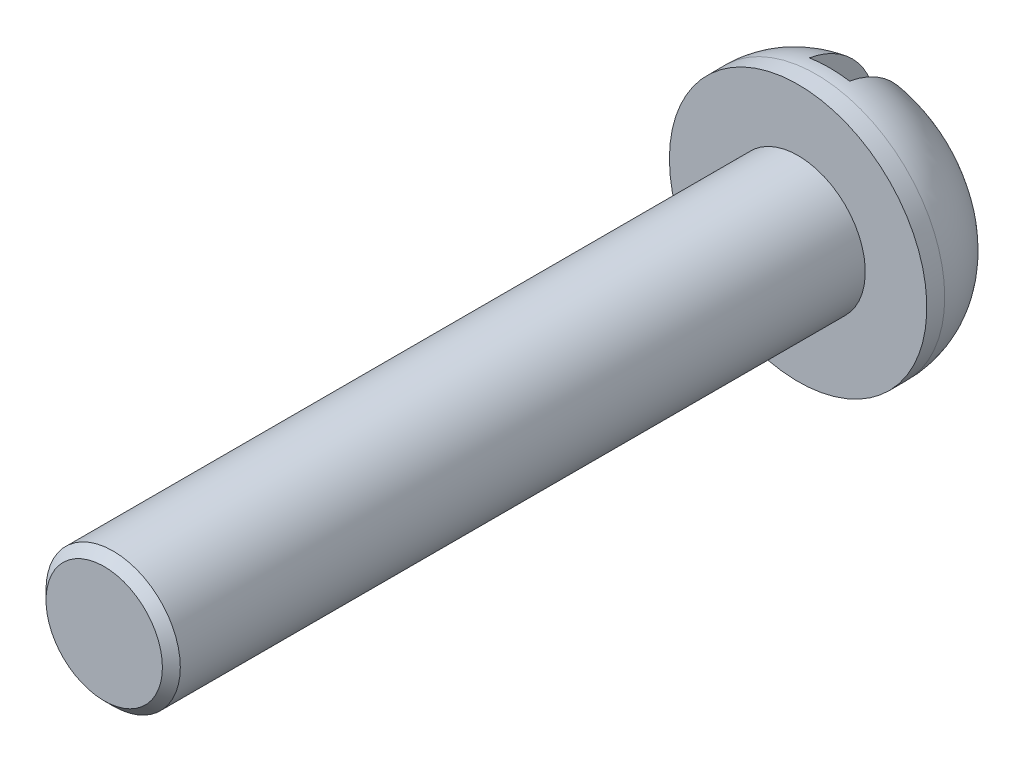
ISO-10303-21;
HEADER;
FILE_DESCRIPTION(('STEP AP214'),'2;1');
FILE_NAME('part.step','',(''),(''),'','','');
FILE_SCHEMA(('AUTOMOTIVE_DESIGN { 1 0 10303 214 1 1 1 1 }'));
ENDSEC;
DATA;
#1=APPLICATION_CONTEXT('core data for automotive mechanical design processes');
#2=APPLICATION_PROTOCOL_DEFINITION('international standard','automotive_design',2000,#1);
#3=PRODUCT_CONTEXT('',#1,'mechanical');
#4=PRODUCT('Part','Part','',(#3));
#5=PRODUCT_RELATED_PRODUCT_CATEGORY('part','',(#4));
#6=PRODUCT_DEFINITION_FORMATION('','',#4);
#7=PRODUCT_DEFINITION_CONTEXT('part definition',#1,'design');
#8=PRODUCT_DEFINITION('design','',#6,#7);
#9=PRODUCT_DEFINITION_SHAPE('','',#8);
#10=(LENGTH_UNIT() NAMED_UNIT(*) SI_UNIT(.MILLI.,.METRE.));
#11=(NAMED_UNIT(*) PLANE_ANGLE_UNIT() SI_UNIT($,.RADIAN.));
#12=(NAMED_UNIT(*) SI_UNIT($,.STERADIAN.) SOLID_ANGLE_UNIT());
#13=UNCERTAINTY_MEASURE_WITH_UNIT(LENGTH_MEASURE(1.E-05),#10,'distance_accuracy_value','');
#14=(GEOMETRIC_REPRESENTATION_CONTEXT(3) GLOBAL_UNCERTAINTY_ASSIGNED_CONTEXT((#13)) GLOBAL_UNIT_ASSIGNED_CONTEXT((#10,
#11,#12)) REPRESENTATION_CONTEXT('',''));
#15=CARTESIAN_POINT('',(0.,0.,0.));
#16=DIRECTION('',(0.,0.,1.));
#17=DIRECTION('',(1.,0.,0.));
#18=AXIS2_PLACEMENT_3D('',#15,#16,#17);
#19=CARTESIAN_POINT('',(0.,0.,0.));
#20=DIRECTION('',(0.,0.,1.));
#21=DIRECTION('',(1.,0.,0.));
#22=AXIS2_PLACEMENT_3D('',#19,#20,#21);
#23=PLANE('',#22);
#24=CARTESIAN_POINT('',(0.,0.,0.));
#25=DIRECTION('',(0.,0.,1.));
#26=DIRECTION('',(1.,0.,0.));
#27=AXIS2_PLACEMENT_3D('',#24,#25,#26);
#28=CIRCLE('',#27,1.075);
#29=CARTESIAN_POINT('',(0.45,0.976281209488332,0.));
#30=VERTEX_POINT('',#29);
#31=CARTESIAN_POINT('',(0.45,-0.976281209488332,0.));
#32=VERTEX_POINT('',#31);
#33=EDGE_CURVE('E100',#30,#32,#28,.F.);
#34=ORIENTED_EDGE('',*,*,#33,.T.);
#35=DIRECTION('',(0.,-1.,0.));
#36=VECTOR('',#35,1.);
#37=CARTESIAN_POINT('',(0.45,3.06077102765736,0.));
#38=LINE('',#37,#36);
#39=EDGE_CURVE('E89',#30,#32,#38,.T.);
#40=ORIENTED_EDGE('',*,*,#39,.F.);
#41=EDGE_LOOP('',(#34,#40));
#42=FACE_BOUND('',#41,.T.);
#43=ADVANCED_FACE('F45',(#42),#23,.F.);
#44=CARTESIAN_POINT('',(0.,0.,17.7));
#45=DIRECTION('',(0.,0.,-1.));
#46=DIRECTION('',(-1.,0.,0.));
#47=AXIS2_PLACEMENT_3D('',#44,#45,#46);
#48=CYLINDRICAL_SURFACE('',#47,1.5);
#49=CARTESIAN_POINT('',(0.,0.,17.5));
#50=DIRECTION('',(0.,0.,1.));
#51=DIRECTION('',(1.,0.,0.));
#52=AXIS2_PLACEMENT_3D('',#49,#50,#51);
#53=CIRCLE('',#52,1.5);
#54=CARTESIAN_POINT('',(1.5,0.,17.5));
#55=VERTEX_POINT('',#54);
#56=EDGE_CURVE('E11',#55,#55,#53,.F.);
#57=ORIENTED_EDGE('',*,*,#56,.T.);
#58=EDGE_LOOP('',(#57));
#59=FACE_BOUND('',#58,.T.);
#60=CARTESIAN_POINT('',(0.,0.,2.2));
#61=DIRECTION('',(0.,0.,-1.));
#62=DIRECTION('',(-1.,0.,0.));
#63=AXIS2_PLACEMENT_3D('',#60,#61,#62);
#64=CIRCLE('',#63,1.5);
#65=CARTESIAN_POINT('',(-1.5,0.,2.2));
#66=VERTEX_POINT('',#65);
#67=EDGE_CURVE('E106',#66,#66,#64,.T.);
#68=ORIENTED_EDGE('',*,*,#67,.F.);
#69=EDGE_LOOP('',(#68));
#70=FACE_BOUND('',#69,.T.);
#71=ADVANCED_FACE('F151',(#59,#70),#48,.T.);
#72=CARTESIAN_POINT('',(0.,0.,17.7));
#73=DIRECTION('',(0.,0.,1.));
#74=DIRECTION('',(1.,0.,0.));
#75=AXIS2_PLACEMENT_3D('',#72,#73,#74);
#76=PLANE('',#75);
#77=CARTESIAN_POINT('',(0.,0.,17.7));
#78=DIRECTION('',(0.,0.,1.));
#79=DIRECTION('',(1.,0.,0.));
#80=AXIS2_PLACEMENT_3D('',#77,#78,#79);
#81=CIRCLE('',#80,1.3);
#82=CARTESIAN_POINT('',(1.3,0.,17.7));
#83=VERTEX_POINT('',#82);
#84=EDGE_CURVE('E54',#83,#83,#81,.T.);
#85=ORIENTED_EDGE('',*,*,#84,.T.);
#86=EDGE_LOOP('',(#85));
#87=FACE_BOUND('',#86,.T.);
#88=ADVANCED_FACE('F147',(#87),#76,.T.);
#89=CARTESIAN_POINT('',(0.,0.,2.2));
#90=DIRECTION('',(0.,0.,-1.));
#91=DIRECTION('',(-1.,0.,0.));
#92=AXIS2_PLACEMENT_3D('',#89,#90,#91);
#93=CYLINDRICAL_SURFACE('',#92,2.875);
#94=CARTESIAN_POINT('',(0.,0.,1.8));
#95=DIRECTION('',(0.,0.,1.));
#96=DIRECTION('',(1.,0.,0.));
#97=AXIS2_PLACEMENT_3D('',#94,#95,#96);
#98=CIRCLE('',#97,2.875);
#99=CARTESIAN_POINT('',(2.875,0.,1.8));
#100=VERTEX_POINT('',#99);
#101=EDGE_CURVE('E109',#100,#100,#98,.T.);
#102=ORIENTED_EDGE('',*,*,#101,.T.);
#103=EDGE_LOOP('',(#102));
#104=FACE_BOUND('',#103,.T.);
#105=CARTESIAN_POINT('',(0.,0.,2.2));
#106=DIRECTION('',(0.,0.,-1.));
#107=DIRECTION('',(-1.,0.,0.));
#108=AXIS2_PLACEMENT_3D('',#105,#106,#107);
#109=CIRCLE('',#108,2.875);
#110=CARTESIAN_POINT('',(-2.875,0.,2.2));
#111=VERTEX_POINT('',#110);
#112=EDGE_CURVE('E111',#111,#111,#109,.T.);
#113=ORIENTED_EDGE('',*,*,#112,.T.);
#114=EDGE_LOOP('',(#113));
#115=FACE_BOUND('',#114,.T.);
#116=ADVANCED_FACE('F143',(#104,#115),#93,.T.);
#117=CARTESIAN_POINT('',(0.,0.,2.2));
#118=DIRECTION('',(0.,0.,-1.));
#119=DIRECTION('',(-1.,0.,0.));
#120=AXIS2_PLACEMENT_3D('',#117,#118,#119);
#121=PLANE('',#120);
#122=ORIENTED_EDGE('',*,*,#67,.T.);
#123=EDGE_LOOP('',(#122));
#124=FACE_BOUND('',#123,.T.);
#125=ORIENTED_EDGE('',*,*,#112,.F.);
#126=EDGE_LOOP('',(#125));
#127=FACE_BOUND('',#126,.T.);
#128=ADVANCED_FACE('F139',(#124,#127),#121,.F.);
#129=CARTESIAN_POINT('',(-0.45,-0.976281209488332,0.));
#130=VERTEX_POINT('',#129);
#131=CARTESIAN_POINT('',(-0.45,0.976281209488332,0.));
#132=VERTEX_POINT('',#131);
#133=EDGE_CURVE('E105',#130,#132,#28,.F.);
#134=ORIENTED_EDGE('',*,*,#133,.T.);
#135=DIRECTION('',(0.,1.,0.));
#136=VECTOR('',#135,1.);
#137=CARTESIAN_POINT('',(-0.45,3.06077102765736,0.));
#138=LINE('',#137,#136);
#139=EDGE_CURVE('E101',#130,#132,#138,.T.);
#140=ORIENTED_EDGE('',*,*,#139,.F.);
#141=EDGE_LOOP('',(#134,#140));
#142=FACE_BOUND('',#141,.T.);
#143=ADVANCED_FACE('F142',(#142),#23,.F.);
#144=CARTESIAN_POINT('',(0.,0.,1.8));
#145=DIRECTION('',(0.,0.,1.));
#146=DIRECTION('',(1.,0.,0.));
#147=AXIS2_PLACEMENT_3D('',#144,#145,#146);
#148=DEGENERATE_TOROIDAL_SURFACE('',#147,1.075,1.8,.T.);
#149=CARTESIAN_POINT('',(0.45,0.,0.111990817560521));
#150=CARTESIAN_POINT('',(0.45,-0.0387826155548397,0.111992743989185));
#151=CARTESIAN_POINT('',(0.45,-0.0775648359462005,0.110071620904703));
#152=CARTESIAN_POINT('',(0.45,-0.15487899058544,0.103121875251416));
#153=CARTESIAN_POINT('',(0.45,-0.193410416254374,0.0980882125636361));
#154=CARTESIAN_POINT('',(0.45,-0.27072407865126,0.0863019588837042));
#155=CARTESIAN_POINT('',(0.45,-0.309502593852977,0.0795269100193666));
#156=CARTESIAN_POINT('',(0.45,-0.386985207156666,0.065635672625954));
#157=CARTESIAN_POINT('',(0.45,-0.425689321131183,0.0585195678841712));
#158=CARTESIAN_POINT('',(0.45,-0.503574337512526,0.0448155729173377));
#159=CARTESIAN_POINT('',(0.45,-0.542756284259483,0.0382333226136575));
#160=CARTESIAN_POINT('',(0.45,-0.62130090475367,0.0263024655528295));
#161=CARTESIAN_POINT('',(0.45,-0.660663544126603,0.0209536333281874));
#162=CARTESIAN_POINT('',(0.45,-0.779038245266762,0.00741689809901502));
#163=CARTESIAN_POINT('',(0.45,-0.858371486625916,0.00173183700961173));
#164=CARTESIAN_POINT('',(0.45,-1.01643830589918,-0.00104421905486276));
#165=CARTESIAN_POINT('',(0.45,-1.09517005898092,0.00178038389110171));
#166=CARTESIAN_POINT('',(0.45,-1.25178689588554,0.0166289274744156));
#167=CARTESIAN_POINT('',(0.45,-1.32967211611734,0.0286513630123992));
#168=CARTESIAN_POINT('',(0.45,-1.45718753062557,0.0564552265827371));
#169=CARTESIAN_POINT('',(0.45,-1.50741186928829,0.0695644438093229));
#170=CARTESIAN_POINT('',(0.45,-1.60658649473929,0.0998756842538949));
#171=CARTESIAN_POINT('',(0.45,-1.65553715931277,0.117076478154114));
#172=CARTESIAN_POINT('',(0.45,-1.80030428590954,0.17489621331869));
#173=CARTESIAN_POINT('',(0.45,-1.8937530351095,0.221671433759531));
#174=CARTESIAN_POINT('',(0.45,-2.07127478753966,0.330481295221218));
#175=CARTESIAN_POINT('',(0.45,-2.15534594854283,0.392518926896082));
#176=CARTESIAN_POINT('',(0.45,-2.31145665473674,0.530089929343106));
#177=CARTESIAN_POINT('',(0.45,-2.38351085064421,0.605606630713727));
#178=CARTESIAN_POINT('',(0.45,-2.51187916211104,0.766024848295385));
#179=CARTESIAN_POINT('',(0.45,-2.56852975758962,0.850657396958423));
#180=CARTESIAN_POINT('',(0.45,-2.6666582757214,1.02834131300746));
#181=CARTESIAN_POINT('',(0.45,-2.70813215989147,1.12139491300888));
#182=CARTESIAN_POINT('',(0.45,-2.77427706019269,1.31216154450052));
#183=CARTESIAN_POINT('',(0.45,-2.79912504581638,1.4098132594205));
#184=CARTESIAN_POINT('',(0.45,-2.83200291825927,1.60789726524021));
#185=CARTESIAN_POINT('',(0.45,-2.84003501465312,1.70832918906859));
#186=CARTESIAN_POINT('',(0.45,-2.83905253230767,1.90873066877063));
#187=CARTESIAN_POINT('',(0.45,-2.83010183721162,2.00870054497298));
#188=CARTESIAN_POINT('',(0.45,-2.79554074152477,2.2057239745265));
#189=CARTESIAN_POINT('',(0.45,-2.76992929056721,2.30277734360471));
#190=CARTESIAN_POINT('',(0.45,-2.70279344778238,2.49120979176871));
#191=CARTESIAN_POINT('',(0.45,-2.66126952345899,2.58258903746696));
#192=CARTESIAN_POINT('',(0.45,-2.56352871236733,2.75709300550172));
#193=CARTESIAN_POINT('',(0.45,-2.5073144409347,2.84021919350612));
#194=CARTESIAN_POINT('',(0.45,-2.38160811822572,2.99619510441082));
#195=CARTESIAN_POINT('',(0.45,-2.31207280966814,3.06900996546156));
#196=CARTESIAN_POINT('',(0.45,-2.16184234459374,3.20209736658302));
#197=CARTESIAN_POINT('',(0.45,-2.08114085785866,3.26236274333375));
#198=CARTESIAN_POINT('',(0.45,-1.91000005946726,3.3693252229814));
#199=CARTESIAN_POINT('',(0.45,-1.8194697703986,3.41587757208682));
#200=CARTESIAN_POINT('',(0.45,-1.67905452004504,3.47406978962672));
#201=CARTESIAN_POINT('',(0.45,-1.63149304020008,3.49152464217923));
#202=CARTESIAN_POINT('',(0.45,-1.53511545655797,3.5225324124537));
#203=CARTESIAN_POINT('',(0.45,-1.48629966208519,3.53608628231919));
#204=CARTESIAN_POINT('',(0.45,-1.38647509436916,3.55957104516167));
#205=CARTESIAN_POINT('',(0.45,-1.33544226007622,3.56939912766612));
#206=CARTESIAN_POINT('',(0.45,-1.2327237210493,3.58498066616109));
#207=CARTESIAN_POINT('',(0.45,-1.18103757398112,3.59073119233643));
#208=CARTESIAN_POINT('',(0.45,-1.07723216207413,3.59828490818898));
#209=CARTESIAN_POINT('',(0.45,-1.02511207550143,3.60007659108487));
#210=CARTESIAN_POINT('',(0.45,-0.920976536590033,3.59991861311204));
#211=CARTESIAN_POINT('',(0.45,-0.868961062572562,3.59797557986048));
#212=CARTESIAN_POINT('',(0.45,-0.774819366749058,3.5914411294002));
#213=CARTESIAN_POINT('',(0.45,-0.732651864720865,3.58740903116742));
#214=CARTESIAN_POINT('',(0.45,-0.648533299396359,3.57749409747983));
#215=CARTESIAN_POINT('',(0.45,-0.606582270588852,3.57161097584003));
#216=CARTESIAN_POINT('',(0.45,-0.522776435447137,3.55850488950656));
#217=CARTESIAN_POINT('',(0.45,-0.480922234232089,3.55127819261063));
#218=CARTESIAN_POINT('',(0.45,-0.397270452976825,3.53632617569089));
#219=CARTESIAN_POINT('',(0.45,-0.355472951206495,3.52860043743096));
#220=CARTESIAN_POINT('',(0.45,-0.271579907355744,3.51392564061571));
#221=CARTESIAN_POINT('',(0.45,-0.229483833975917,3.5069794466245));
#222=CARTESIAN_POINT('',(0.45,-0.14496880634488,3.49579594154042));
#223=CARTESIAN_POINT('',(0.45,-0.10255067804166,3.49155317619297));
#224=CARTESIAN_POINT('',(0.45,-0.0388281288627513,3.48844598399214));
#225=CARTESIAN_POINT('',(0.45,-0.0176044559393729,3.48795133212002));
#226=CARTESIAN_POINT('',(0.45,0.0248395699279757,3.48807780019897));
#227=CARTESIAN_POINT('',(0.45,0.0460599228607077,3.48869892384863));
#228=CARTESIAN_POINT('',(0.45,0.109686411643126,3.49215845615111));
#229=CARTESIAN_POINT('',(0.45,0.152003589919307,3.49659551071752));
#230=CARTESIAN_POINT('',(0.45,0.237977383119774,3.50826924452313));
#231=CARTESIAN_POINT('',(0.45,0.281617254991609,3.51561384646717));
#232=CARTESIAN_POINT('',(0.45,0.36875299177796,3.53101139690848));
#233=CARTESIAN_POINT('',(0.45,0.412248888212945,3.53906417802649));
#234=CARTESIAN_POINT('',(0.45,0.499540591917558,3.55451703597811));
#235=CARTESIAN_POINT('',(0.45,0.543336904685045,3.56191440079828));
#236=CARTESIAN_POINT('',(0.45,0.631165230665646,3.57512845538778));
#237=CARTESIAN_POINT('',(0.45,0.675197188689329,3.58094550006173));
#238=CARTESIAN_POINT('',(0.45,0.763307298765446,3.59042032079326));
#239=CARTESIAN_POINT('',(0.45,0.80738440291013,3.59408744700503));
#240=CARTESIAN_POINT('',(0.45,0.895672532687234,3.59895189881418));
#241=CARTESIAN_POINT('',(0.45,0.939883566950239,3.60014906170176));
#242=CARTESIAN_POINT('',(0.45,1.07255214122173,3.59965973236802));
#243=CARTESIAN_POINT('',(0.45,1.16105918970058,3.5938940996656));
#244=CARTESIAN_POINT('',(0.45,1.30023218803208,3.57536976748434));
#245=CARTESIAN_POINT('',(0.45,1.35144429168455,3.56647785915307));
#246=CARTESIAN_POINT('',(0.45,1.45294959519744,3.54458223967519));
#247=CARTESIAN_POINT('',(0.45,1.50324350952078,3.53158188344366));
#248=CARTESIAN_POINT('',(0.45,1.60314213880058,3.5012960279312));
#249=CARTESIAN_POINT('',(0.45,1.65273288494521,3.48396429591564));
#250=CARTESIAN_POINT('',(0.45,1.75027071259029,3.4451627623954));
#251=CARTESIAN_POINT('',(0.45,1.79821730615756,3.42369174478624));
#252=CARTESIAN_POINT('',(0.45,1.93888821667195,3.35328313410146));
#253=CARTESIAN_POINT('',(0.45,2.0286745805483,3.29828021502286));
#254=CARTESIAN_POINT('',(0.45,2.19694325298825,3.17389126098089));
#255=CARTESIAN_POINT('',(0.45,2.27547692910342,3.1045743578116));
#256=CARTESIAN_POINT('',(0.45,2.41765641549566,2.95514162554828));
#257=CARTESIAN_POINT('',(0.45,2.48160831379603,2.87531734123359));
#258=CARTESIAN_POINT('',(0.45,2.59507825814024,2.70581634459148));
#259=CARTESIAN_POINT('',(0.45,2.64457454393616,2.61612505585185));
#260=CARTESIAN_POINT('',(0.45,2.72691235866232,2.43093820793361));
#261=CARTESIAN_POINT('',(0.45,2.75998180441267,2.33554392231157));
#262=CARTESIAN_POINT('',(0.45,2.80953018097771,2.1405880555792));
#263=CARTESIAN_POINT('',(0.45,2.82601747427527,2.04102860140286));
#264=CARTESIAN_POINT('',(0.45,2.8419051144125,1.84104159473499));
#265=CARTESIAN_POINT('',(0.45,2.84138762367965,1.74062055962017));
#266=CARTESIAN_POINT('',(0.45,2.82348353409932,1.54128214590026));
#267=CARTESIAN_POINT('',(0.45,2.8060950622689,1.44236493548522));
#268=CARTESIAN_POINT('',(0.45,2.75497887225999,1.24894951877124));
#269=CARTESIAN_POINT('',(0.45,2.72126681337434,1.15444717234543));
#270=CARTESIAN_POINT('',(0.45,2.63849368490103,0.972426863585774));
#271=CARTESIAN_POINT('',(0.45,2.58943287803842,0.884908781734206));
#272=CARTESIAN_POINT('',(0.45,2.4772449779073,0.719085873615677));
#273=CARTESIAN_POINT('',(0.45,2.41408252833263,0.640804974829747));
#274=CARTESIAN_POINT('',(0.45,2.27560686477592,0.495870694847435));
#275=CARTESIAN_POINT('',(0.45,2.20029443585524,0.429216562975385));
#276=CARTESIAN_POINT('',(0.45,2.03908498896593,0.308833340377374));
#277=CARTESIAN_POINT('',(0.45,1.95311270694017,0.255205107568513));
#278=CARTESIAN_POINT('',(0.45,1.77349387660786,0.162813658121992));
#279=CARTESIAN_POINT('',(0.45,1.67984414427691,0.124056647177889));
#280=CARTESIAN_POINT('',(0.45,1.48550845860714,0.0614818226616815));
#281=CARTESIAN_POINT('',(0.45,1.38471549937438,0.0379977495445135));
#282=CARTESIAN_POINT('',(0.45,1.18093294073881,0.00724140029146806));
#283=CARTESIAN_POINT('',(0.45,1.07794796922707,-6.2157747013705E-05));
#284=CARTESIAN_POINT('',(0.45,0.893449953600242,4.99140293479615E-05));
#285=CARTESIAN_POINT('',(0.45,0.811908685727201,0.00472960025778218));
#286=CARTESIAN_POINT('',(0.45,0.690041197463315,0.0173056038902441));
#287=CARTESIAN_POINT('',(0.45,0.649398743618315,0.0224421575558926));
#288=CARTESIAN_POINT('',(0.45,0.568318319537822,0.0341453203830687));
#289=CARTESIAN_POINT('',(0.45,0.527880368762083,0.040712063110364));
#290=CARTESIAN_POINT('',(0.45,0.446847504127388,0.0546976276373903));
#291=CARTESIAN_POINT('',(0.45,0.406253675523876,0.0621224502215177));
#292=CARTESIAN_POINT('',(0.45,0.3250026767942,0.0767849136464867));
#293=CARTESIAN_POINT('',(0.45,0.284345482513635,0.084022427064857));
#294=CARTESIAN_POINT('',(0.45,0.20321240405912,0.0967416961237444));
#295=CARTESIAN_POINT('',(0.45,0.162739817914281,0.102242698843929));
#296=CARTESIAN_POINT('',(0.45,0.0815108983093145,0.109863118483228));
#297=CARTESIAN_POINT('',(0.45,0.0407552309624018,0.111988793147158));
#298=CARTESIAN_POINT('',(0.45,0.,0.111990817560521));
#299=B_SPLINE_CURVE_WITH_KNOTS('',3,(#149,#150,#151,#152,#153,#154,#155,#156,#157,#158,#159,
#160,#161,#162,#163,#164,#165,#166,#167,#168,#169,#170,#171,#172,#173,#174,#175,#176,#177,#178,
#179,#180,#181,#182,#183,#184,#185,#186,#187,#188,#189,#190,#191,#192,#193,#194,#195,#196,#197,
#198,#199,#200,#201,#202,#203,#204,#205,#206,#207,#208,#209,#210,#211,#212,#213,#214,#215,#216,
#217,#218,#219,#220,#221,#222,#223,#224,#225,#226,#227,#228,#229,#230,#231,#232,#233,#234,#235,
#236,#237,#238,#239,#240,#241,#242,#243,#244,#245,#246,#247,#248,#249,#250,#251,#252,#253,#254,
#255,#256,#257,#258,#259,#260,#261,#262,#263,#264,#265,#266,#267,#268,#269,#270,#271,#272,#273,
#274,#275,#276,#277,#278,#279,#280,#281,#282,#283,#284,#285,#286,#287,#288,#289,#290,#291,#292,
#293,#294,#295,#296,#297,#298),.UNSPECIFIED.,.T.,.F.,(4,2,2,2,2,2,2,2,2,2,2,2,2,2,2,2,2,2,2,2,2,
2,2,2,2,2,2,2,2,2,2,2,2,2,2,2,2,2,2,2,2,2,2,2,2,2,2,2,2,2,2,2,2,2,2,2,2,2,2,2,2,2,2,2,2,2,2,2,2,
2,2,2,2,2,4),(0.,0.116315567840449,0.232819979899999,0.350909696927653,0.468970550060058,
0.588149359555587,0.707306365992587,0.945515397594475,1.18136958572248,1.41718518779462,
1.57273736888934,1.72824287309618,2.04011118048289,2.35204064688972,2.66358699346842,
2.96765061572248,3.2717950897749,3.5726483781874,3.87346213258988,4.17314656810007,
4.47284989885613,4.77254442508975,5.07218563274394,5.37281688176326,5.67361926532216,
5.97749160955239,6.12934514264572,6.28116158015995,6.43690596670123,6.59276214597212,
6.74907074446506,6.90510221422086,7.03213504938362,7.15918753463239,7.28659836912599,
7.41411740531053,7.54209066553262,7.66980491115937,7.73346439964587,7.79712409915117,
7.92460597795563,8.05734586155444,8.19005445576053,8.32328876566145,8.45649312932897,
8.58911379541975,8.72174319766976,8.98695984515768,9.14274996290197,9.29841319138144,
9.45581477781178,9.61326267882598,9.92744416082817,10.2401423244277,10.5455034336484,
10.8513218658447,11.1527695970169,11.4540652298762,11.7539053003499,12.0537786622843,
12.3533649225342,12.6529460550362,12.9532869194017,13.253608385245,13.5561859458534,
13.8588896337448,14.1680035296945,14.4765192901577,14.7211189478621,14.8439918123537,
14.9668761569017,15.090678803447,15.2145635671221,15.3370226405778,15.4592544128305),.UNSPECIFIED.);
#300=CARTESIAN_POINT('',(0.45,-2.81407115405763,1.5));
#301=VERTEX_POINT('',#300);
#302=EDGE_CURVE('E97',#32,#301,#299,.T.);
#303=ORIENTED_EDGE('',*,*,#302,.F.);
#304=ORIENTED_EDGE('',*,*,#33,.F.);
#305=CARTESIAN_POINT('',(0.45,2.81407115405763,1.5));
#306=VERTEX_POINT('',#305);
#307=EDGE_CURVE('E86',#306,#30,#299,.T.);
#308=ORIENTED_EDGE('',*,*,#307,.F.);
#309=CARTESIAN_POINT('',(0.,0.,1.5));
#310=DIRECTION('',(0.,0.,1.));
#311=DIRECTION('',(1.,0.,0.));
#312=AXIS2_PLACEMENT_3D('',#309,#310,#311);
#313=CIRCLE('',#312,2.84982393492988);
#314=CARTESIAN_POINT('',(-0.45,2.81407115405763,1.5));
#315=VERTEX_POINT('',#314);
#316=EDGE_CURVE('E117',#315,#306,#313,.F.);
#317=ORIENTED_EDGE('',*,*,#316,.F.);
#318=CARTESIAN_POINT('',(-0.45,0.,0.11199081756052));
#319=CARTESIAN_POINT('',(-0.45,0.0387826155548397,0.111992743989185));
#320=CARTESIAN_POINT('',(-0.45,0.0775648359462005,0.110071620904703));
#321=CARTESIAN_POINT('',(-0.45,0.15487899058544,0.103121875251416));
#322=CARTESIAN_POINT('',(-0.45,0.193410416254374,0.098088212563636));
#323=CARTESIAN_POINT('',(-0.45,0.27072407865126,0.0863019588837041));
#324=CARTESIAN_POINT('',(-0.45,0.309502593852977,0.0795269100193665));
#325=CARTESIAN_POINT('',(-0.45,0.386985207156666,0.065635672625954));
#326=CARTESIAN_POINT('',(-0.45,0.425689321131183,0.0585195678841712));
#327=CARTESIAN_POINT('',(-0.45,0.503574337512526,0.0448155729173377));
#328=CARTESIAN_POINT('',(-0.45,0.542756284259483,0.0382333226136575));
#329=CARTESIAN_POINT('',(-0.45,0.62130090475367,0.0263024655528295));
#330=CARTESIAN_POINT('',(-0.45,0.660663544126603,0.0209536333281874));
#331=CARTESIAN_POINT('',(-0.45,0.779038245266762,0.00741689809901496));
#332=CARTESIAN_POINT('',(-0.45,0.858371486625916,0.00173183700961158));
#333=CARTESIAN_POINT('',(-0.45,1.01643830589918,-0.00104421905486281));
#334=CARTESIAN_POINT('',(-0.45,1.09517005898092,0.00178038389110183));
#335=CARTESIAN_POINT('',(-0.45,1.25178689588554,0.0166289274744158));
#336=CARTESIAN_POINT('',(-0.45,1.32967211611734,0.0286513630123994));
#337=CARTESIAN_POINT('',(-0.45,1.45718753062557,0.056455226582737));
#338=CARTESIAN_POINT('',(-0.45,1.50741186928829,0.0695644438093227));
#339=CARTESIAN_POINT('',(-0.45,1.60658649473929,0.0998756842538947));
#340=CARTESIAN_POINT('',(-0.45,1.65553715931277,0.117076478154114));
#341=CARTESIAN_POINT('',(-0.45,1.80030428590954,0.17489621331869));
#342=CARTESIAN_POINT('',(-0.45,1.8937530351095,0.22167143375953));
#343=CARTESIAN_POINT('',(-0.45,2.07127478753966,0.330481295221217));
#344=CARTESIAN_POINT('',(-0.45,2.15534594854282,0.392518926896082));
#345=CARTESIAN_POINT('',(-0.45,2.31145665473674,0.530089929343105));
#346=CARTESIAN_POINT('',(-0.45,2.38351085064421,0.605606630713727));
#347=CARTESIAN_POINT('',(-0.45,2.51187916211104,0.766024848295384));
#348=CARTESIAN_POINT('',(-0.45,2.56852975758962,0.850657396958423));
#349=CARTESIAN_POINT('',(-0.45,2.6666582757214,1.02834131300746));
#350=CARTESIAN_POINT('',(-0.45,2.70813215989147,1.12139491300888));
#351=CARTESIAN_POINT('',(-0.45,2.77427706019269,1.31216154450052));
#352=CARTESIAN_POINT('',(-0.45,2.79912504581638,1.4098132594205));
#353=CARTESIAN_POINT('',(-0.45,2.83200291825927,1.60789726524021));
#354=CARTESIAN_POINT('',(-0.45,2.84003501465312,1.70832918906859));
#355=CARTESIAN_POINT('',(-0.45,2.83905253230767,1.90873066877063));
#356=CARTESIAN_POINT('',(-0.45,2.83010183721162,2.00870054497298));
#357=CARTESIAN_POINT('',(-0.45,2.79554074152477,2.2057239745265));
#358=CARTESIAN_POINT('',(-0.45,2.76992929056721,2.30277734360471));
#359=CARTESIAN_POINT('',(-0.45,2.70279344778238,2.49120979176871));
#360=CARTESIAN_POINT('',(-0.45,2.66126952345899,2.58258903746696));
#361=CARTESIAN_POINT('',(-0.45,2.56352871236732,2.75709300550172));
#362=CARTESIAN_POINT('',(-0.45,2.5073144409347,2.84021919350612));
#363=CARTESIAN_POINT('',(-0.45,2.38160811822572,2.99619510441082));
#364=CARTESIAN_POINT('',(-0.45,2.31207280966814,3.06900996546156));
#365=CARTESIAN_POINT('',(-0.45,2.16184234459374,3.20209736658302));
#366=CARTESIAN_POINT('',(-0.45,2.08114085785866,3.26236274333375));
#367=CARTESIAN_POINT('',(-0.45,1.91000005946726,3.3693252229814));
#368=CARTESIAN_POINT('',(-0.45,1.8194697703986,3.41587757208682));
#369=CARTESIAN_POINT('',(-0.45,1.67905452004504,3.47406978962672));
#370=CARTESIAN_POINT('',(-0.45,1.63149304020008,3.49152464217923));
#371=CARTESIAN_POINT('',(-0.45,1.53511545655797,3.5225324124537));
#372=CARTESIAN_POINT('',(-0.45,1.48629966208519,3.53608628231919));
#373=CARTESIAN_POINT('',(-0.45,1.38647509436916,3.55957104516167));
#374=CARTESIAN_POINT('',(-0.45,1.33544226007622,3.56939912766612));
#375=CARTESIAN_POINT('',(-0.45,1.2327237210493,3.58498066616109));
#376=CARTESIAN_POINT('',(-0.45,1.18103757398112,3.59073119233643));
#377=CARTESIAN_POINT('',(-0.45,1.07723216207413,3.59828490818898));
#378=CARTESIAN_POINT('',(-0.45,1.02511207550143,3.60007659108487));
#379=CARTESIAN_POINT('',(-0.45,0.920976536590034,3.59991861311204));
#380=CARTESIAN_POINT('',(-0.45,0.868961062572564,3.59797557986048));
#381=CARTESIAN_POINT('',(-0.45,0.774819366749059,3.5914411294002));
#382=CARTESIAN_POINT('',(-0.45,0.732651864720866,3.58740903116742));
#383=CARTESIAN_POINT('',(-0.45,0.648533299396359,3.57749409747983));
#384=CARTESIAN_POINT('',(-0.45,0.606582270588852,3.57161097584003));
#385=CARTESIAN_POINT('',(-0.45,0.522776435447137,3.55850488950656));
#386=CARTESIAN_POINT('',(-0.45,0.48092223423209,3.55127819261063));
#387=CARTESIAN_POINT('',(-0.45,0.397270452976825,3.53632617569089));
#388=CARTESIAN_POINT('',(-0.45,0.355472951206496,3.52860043743096));
#389=CARTESIAN_POINT('',(-0.45,0.271579907355745,3.51392564061571));
#390=CARTESIAN_POINT('',(-0.45,0.229483833975918,3.5069794466245));
#391=CARTESIAN_POINT('',(-0.45,0.14496880634488,3.49579594154042));
#392=CARTESIAN_POINT('',(-0.45,0.102550678041661,3.49155317619297));
#393=CARTESIAN_POINT('',(-0.45,0.0388281288627518,3.48844598399214));
#394=CARTESIAN_POINT('',(-0.45,0.0176044559393732,3.48795133212002));
#395=CARTESIAN_POINT('',(-0.45,-0.0248395699279755,3.48807780019897));
#396=CARTESIAN_POINT('',(-0.45,-0.0460599228607073,3.48869892384863));
#397=CARTESIAN_POINT('',(-0.45,-0.109686411643125,3.49215845615111));
#398=CARTESIAN_POINT('',(-0.45,-0.152003589919306,3.49659551071752));
#399=CARTESIAN_POINT('',(-0.45,-0.237977383119773,3.50826924452313));
#400=CARTESIAN_POINT('',(-0.45,-0.281617254991608,3.51561384646717));
#401=CARTESIAN_POINT('',(-0.45,-0.368752991777958,3.53101139690848));
#402=CARTESIAN_POINT('',(-0.45,-0.412248888212943,3.53906417802649));
#403=CARTESIAN_POINT('',(-0.45,-0.499540591917555,3.55451703597811));
#404=CARTESIAN_POINT('',(-0.45,-0.543336904685042,3.56191440079828));
#405=CARTESIAN_POINT('',(-0.45,-0.631165230665644,3.57512845538778));
#406=CARTESIAN_POINT('',(-0.45,-0.675197188689327,3.58094550006172));
#407=CARTESIAN_POINT('',(-0.45,-0.763307298765444,3.59042032079326));
#408=CARTESIAN_POINT('',(-0.45,-0.807384402910129,3.59408744700503));
#409=CARTESIAN_POINT('',(-0.45,-0.895672532687233,3.59895189881418));
#410=CARTESIAN_POINT('',(-0.45,-0.939883566950238,3.60014906170176));
#411=CARTESIAN_POINT('',(-0.45,-1.07255214122173,3.59965973236802));
#412=CARTESIAN_POINT('',(-0.45,-1.16105918970058,3.5938940996656));
#413=CARTESIAN_POINT('',(-0.45,-1.30023218803208,3.57536976748434));
#414=CARTESIAN_POINT('',(-0.45,-1.35144429168455,3.56647785915307));
#415=CARTESIAN_POINT('',(-0.45,-1.45294959519744,3.54458223967519));
#416=CARTESIAN_POINT('',(-0.45,-1.50324350952077,3.53158188344366));
#417=CARTESIAN_POINT('',(-0.45,-1.60314213880058,3.5012960279312));
#418=CARTESIAN_POINT('',(-0.45,-1.65273288494521,3.48396429591564));
#419=CARTESIAN_POINT('',(-0.45,-1.75027071259029,3.4451627623954));
#420=CARTESIAN_POINT('',(-0.45,-1.79821730615756,3.42369174478624));
#421=CARTESIAN_POINT('',(-0.45,-1.93888821667194,3.35328313410146));
#422=CARTESIAN_POINT('',(-0.45,-2.0286745805483,3.29828021502286));
#423=CARTESIAN_POINT('',(-0.45,-2.19694325298824,3.17389126098089));
#424=CARTESIAN_POINT('',(-0.45,-2.27547692910342,3.1045743578116));
#425=CARTESIAN_POINT('',(-0.45,-2.41765641549566,2.95514162554828));
#426=CARTESIAN_POINT('',(-0.45,-2.48160831379603,2.87531734123359));
#427=CARTESIAN_POINT('',(-0.45,-2.59507825814024,2.70581634459148));
#428=CARTESIAN_POINT('',(-0.45,-2.64457454393616,2.61612505585185));
#429=CARTESIAN_POINT('',(-0.45,-2.72691235866232,2.43093820793361));
#430=CARTESIAN_POINT('',(-0.45,-2.75998180441267,2.33554392231157));
#431=CARTESIAN_POINT('',(-0.45,-2.80953018097771,2.1405880555792));
#432=CARTESIAN_POINT('',(-0.45,-2.82601747427527,2.04102860140286));
#433=CARTESIAN_POINT('',(-0.45,-2.8419051144125,1.841041594735));
#434=CARTESIAN_POINT('',(-0.45,-2.84138762367965,1.74062055962017));
#435=CARTESIAN_POINT('',(-0.45,-2.82348353409932,1.54128214590026));
#436=CARTESIAN_POINT('',(-0.45,-2.8060950622689,1.44236493548523));
#437=CARTESIAN_POINT('',(-0.45,-2.75497887225999,1.24894951877124));
#438=CARTESIAN_POINT('',(-0.45,-2.72126681337434,1.15444717234543));
#439=CARTESIAN_POINT('',(-0.45,-2.63849368490103,0.972426863585776));
#440=CARTESIAN_POINT('',(-0.45,-2.58943287803842,0.884908781734207));
#441=CARTESIAN_POINT('',(-0.45,-2.4772449779073,0.719085873615678));
#442=CARTESIAN_POINT('',(-0.45,-2.41408252833263,0.640804974829749));
#443=CARTESIAN_POINT('',(-0.45,-2.27560686477592,0.495870694847436));
#444=CARTESIAN_POINT('',(-0.45,-2.20029443585524,0.429216562975386));
#445=CARTESIAN_POINT('',(-0.45,-2.03908498896593,0.308833340377375));
#446=CARTESIAN_POINT('',(-0.45,-1.95311270694017,0.255205107568514));
#447=CARTESIAN_POINT('',(-0.45,-1.77349387660787,0.162813658121992));
#448=CARTESIAN_POINT('',(-0.45,-1.67984414427691,0.124056647177889));
#449=CARTESIAN_POINT('',(-0.45,-1.48550845860714,0.0614818226616819));
#450=CARTESIAN_POINT('',(-0.45,-1.38471549937438,0.0379977495445138));
#451=CARTESIAN_POINT('',(-0.45,-1.18093294073881,0.00724140029146825));
#452=CARTESIAN_POINT('',(-0.45,-1.07794796922707,-6.21577470136066E-05));
#453=CARTESIAN_POINT('',(-0.45,-0.893449953600243,4.9914029347932E-05));
#454=CARTESIAN_POINT('',(-0.45,-0.811908685727203,0.00472960025778213));
#455=CARTESIAN_POINT('',(-0.45,-0.690041197463316,0.017305603890244));
#456=CARTESIAN_POINT('',(-0.45,-0.649398743618317,0.0224421575558924));
#457=CARTESIAN_POINT('',(-0.45,-0.568318319537823,0.0341453203830685));
#458=CARTESIAN_POINT('',(-0.45,-0.527880368762084,0.0407120631103638));
#459=CARTESIAN_POINT('',(-0.45,-0.446847504127389,0.0546976276373902));
#460=CARTESIAN_POINT('',(-0.45,-0.406253675523876,0.0621224502215176));
#461=CARTESIAN_POINT('',(-0.45,-0.3250026767942,0.0767849136464868));
#462=CARTESIAN_POINT('',(-0.45,-0.284345482513635,0.0840224270648571));
#463=CARTESIAN_POINT('',(-0.45,-0.20321240405912,0.0967416961237445));
#464=CARTESIAN_POINT('',(-0.45,-0.162739817914281,0.102242698843929));
#465=CARTESIAN_POINT('',(-0.45,-0.0815108983093141,0.109863118483228));
#466=CARTESIAN_POINT('',(-0.45,-0.0407552309624016,0.111988793147158));
#467=CARTESIAN_POINT('',(-0.45,0.,0.11199081756052));
#468=B_SPLINE_CURVE_WITH_KNOTS('',3,(#318,#319,#320,#321,#322,#323,#324,#325,#326,#327,#328,
#329,#330,#331,#332,#333,#334,#335,#336,#337,#338,#339,#340,#341,#342,#343,#344,#345,#346,#347,
#348,#349,#350,#351,#352,#353,#354,#355,#356,#357,#358,#359,#360,#361,#362,#363,#364,#365,#366,
#367,#368,#369,#370,#371,#372,#373,#374,#375,#376,#377,#378,#379,#380,#381,#382,#383,#384,#385,
#386,#387,#388,#389,#390,#391,#392,#393,#394,#395,#396,#397,#398,#399,#400,#401,#402,#403,#404,
#405,#406,#407,#408,#409,#410,#411,#412,#413,#414,#415,#416,#417,#418,#419,#420,#421,#422,#423,
#424,#425,#426,#427,#428,#429,#430,#431,#432,#433,#434,#435,#436,#437,#438,#439,#440,#441,#442,
#443,#444,#445,#446,#447,#448,#449,#450,#451,#452,#453,#454,#455,#456,#457,#458,#459,#460,#461,
#462,#463,#464,#465,#466,#467),.UNSPECIFIED.,.T.,.F.,(4,2,2,2,2,2,2,2,2,2,2,2,2,2,2,2,2,2,2,2,2,
2,2,2,2,2,2,2,2,2,2,2,2,2,2,2,2,2,2,2,2,2,2,2,2,2,2,2,2,2,2,2,2,2,2,2,2,2,2,2,2,2,2,2,2,2,2,2,2,
2,2,2,2,2,4),(0.,0.116315567840449,0.2328199799,0.350909696927653,0.468970550060058,
0.588149359555587,0.707306365992587,0.945515397594474,1.18136958572247,1.41718518779462,
1.57273736888934,1.72824287309618,2.04011118048289,2.35204064688972,2.66358699346842,
2.96765061572248,3.2717950897749,3.5726483781874,3.87346213258988,4.17314656810007,
4.47284989885613,4.77254442508975,5.07218563274394,5.37281688176326,5.67361926532216,
5.97749160955239,6.12934514264571,6.28116158015995,6.43690596670123,6.59276214597212,
6.74907074446506,6.90510221422085,7.03213504938362,7.15918753463239,7.28659836912599,
7.41411740531053,7.54209066553261,7.66980491115937,7.73346439964587,7.79712409915117,
7.92460597795563,8.05734586155443,8.19005445576052,8.32328876566145,8.45649312932897,
8.58911379541974,8.72174319766975,8.98695984515768,9.14274996290197,9.29841319138144,
9.45581477781177,9.61326267882598,9.92744416082817,10.2401423244277,10.5455034336484,
10.8513218658447,11.1527695970168,11.4540652298762,11.7539053003498,12.0537786622843,
12.3533649225342,12.6529460550362,12.9532869194017,13.253608385245,13.5561859458534,
13.8588896337448,14.1680035296945,14.4765192901577,14.7211189478621,14.8439918123537,
14.9668761569017,15.090678803447,15.2145635671221,15.3370226405778,15.4592544128305),.UNSPECIFIED.);
#469=EDGE_CURVE('E95',#132,#315,#468,.T.);
#470=ORIENTED_EDGE('',*,*,#469,.F.);
#471=ORIENTED_EDGE('',*,*,#133,.F.);
#472=CARTESIAN_POINT('',(-0.45,-2.81407115405763,1.5));
#473=VERTEX_POINT('',#472);
#474=EDGE_CURVE('E123',#473,#130,#468,.T.);
#475=ORIENTED_EDGE('',*,*,#474,.F.);
#476=EDGE_CURVE('E66',#301,#473,#313,.F.);
#477=ORIENTED_EDGE('',*,*,#476,.F.);
#478=EDGE_LOOP('',(#303,#304,#308,#317,#470,#471,#475,#477));
#479=FACE_BOUND('',#478,.T.);
#480=ORIENTED_EDGE('',*,*,#101,.F.);
#481=EDGE_LOOP('',(#480));
#482=FACE_BOUND('',#481,.T.);
#483=ADVANCED_FACE('F103',(#479,#482),#148,.T.);
#484=CARTESIAN_POINT('',(0.45,3.06077102765736,1.5));
#485=DIRECTION('',(1.,0.,0.));
#486=DIRECTION('',(0.,1.,0.));
#487=AXIS2_PLACEMENT_3D('',#484,#485,#486);
#488=PLANE('',#487);
#489=ORIENTED_EDGE('',*,*,#302,.T.);
#490=DIRECTION('',(0.,-1.,0.));
#491=VECTOR('',#490,1.);
#492=CARTESIAN_POINT('',(0.45,3.06077102765736,1.5));
#493=LINE('',#492,#491);
#494=EDGE_CURVE('E91',#306,#301,#493,.T.);
#495=ORIENTED_EDGE('',*,*,#494,.F.);
#496=ORIENTED_EDGE('',*,*,#307,.T.);
#497=ORIENTED_EDGE('',*,*,#39,.T.);
#498=EDGE_LOOP('',(#489,#495,#496,#497));
#499=FACE_BOUND('',#498,.T.);
#500=ADVANCED_FACE('F88',(#499),#488,.F.);
#501=CARTESIAN_POINT('',(-0.45,3.06077102765736,1.5));
#502=DIRECTION('',(-1.,0.,0.));
#503=DIRECTION('',(0.,-1.,0.));
#504=AXIS2_PLACEMENT_3D('',#501,#502,#503);
#505=PLANE('',#504);
#506=ORIENTED_EDGE('',*,*,#469,.T.);
#507=DIRECTION('',(0.,1.,0.));
#508=VECTOR('',#507,1.);
#509=CARTESIAN_POINT('',(-0.45,3.06077102765736,1.5));
#510=LINE('',#509,#508);
#511=EDGE_CURVE('E61',#473,#315,#510,.T.);
#512=ORIENTED_EDGE('',*,*,#511,.F.);
#513=ORIENTED_EDGE('',*,*,#474,.T.);
#514=ORIENTED_EDGE('',*,*,#139,.T.);
#515=EDGE_LOOP('',(#506,#512,#513,#514));
#516=FACE_BOUND('',#515,.T.);
#517=ADVANCED_FACE('F130',(#516),#505,.F.);
#518=CARTESIAN_POINT('',(0.,0.,1.5));
#519=DIRECTION('',(0.,0.,1.));
#520=DIRECTION('',(1.,0.,0.));
#521=AXIS2_PLACEMENT_3D('',#518,#519,#520);
#522=PLANE('',#521);
#523=ORIENTED_EDGE('',*,*,#476,.T.);
#524=ORIENTED_EDGE('',*,*,#511,.T.);
#525=ORIENTED_EDGE('',*,*,#316,.T.);
#526=ORIENTED_EDGE('',*,*,#494,.T.);
#527=EDGE_LOOP('',(#523,#524,#525,#526));
#528=FACE_BOUND('',#527,.T.);
#529=ADVANCED_FACE('F134',(#528),#522,.F.);
#530=CARTESIAN_POINT('',(0.,0.,17.7));
#531=DIRECTION('',(0.,0.,-1.));
#532=DIRECTION('',(-1.,0.,0.));
#533=AXIS2_PLACEMENT_3D('',#530,#531,#532);
#534=CONICAL_SURFACE('',#533,1.3,0.785398163397449);
#535=ORIENTED_EDGE('',*,*,#56,.F.);
#536=EDGE_LOOP('',(#535));
#537=FACE_BOUND('',#536,.T.);
#538=ORIENTED_EDGE('',*,*,#84,.F.);
#539=EDGE_LOOP('',(#538));
#540=FACE_BOUND('',#539,.T.);
#541=ADVANCED_FACE('F48',(#537,#540),#534,.T.);
#542=CLOSED_SHELL('',(#43,#71,#88,#116,#128,#143,#483,#500,#517,#529,#541));
#543=MANIFOLD_SOLID_BREP('B2',#542);
#544=ADVANCED_BREP_SHAPE_REPRESENTATION('',(#18,#543),#14);
#545=SHAPE_DEFINITION_REPRESENTATION(#9,#544);
ENDSEC;
END-ISO-10303-21;
